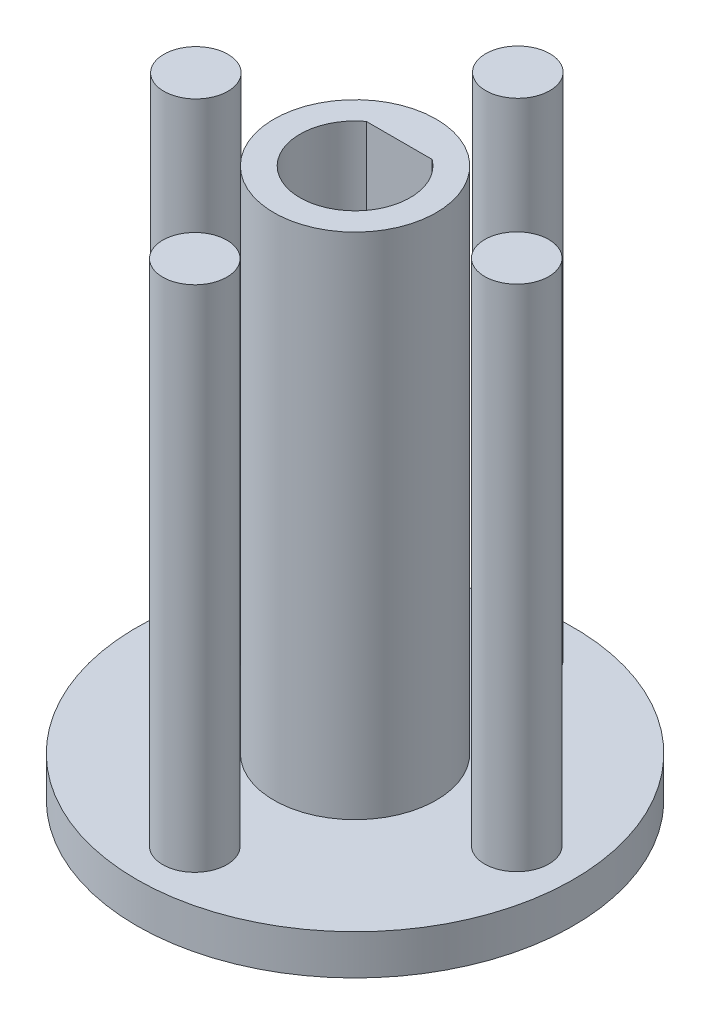
ISO-10303-21;
HEADER;
FILE_DESCRIPTION(('STEP AP214'),'2;1');
FILE_NAME('part.step','',(''),(''),'','','');
FILE_SCHEMA(('AUTOMOTIVE_DESIGN { 1 0 10303 214 1 1 1 1 }'));
ENDSEC;
DATA;
#1=APPLICATION_CONTEXT('core data for automotive mechanical design processes');
#2=APPLICATION_PROTOCOL_DEFINITION('international standard','automotive_design',2000,#1);
#3=PRODUCT_CONTEXT('',#1,'mechanical');
#4=PRODUCT('Part','Part','',(#3));
#5=PRODUCT_RELATED_PRODUCT_CATEGORY('part','',(#4));
#6=PRODUCT_DEFINITION_FORMATION('','',#4);
#7=PRODUCT_DEFINITION_CONTEXT('part definition',#1,'design');
#8=PRODUCT_DEFINITION('design','',#6,#7);
#9=PRODUCT_DEFINITION_SHAPE('','',#8);
#10=(LENGTH_UNIT() NAMED_UNIT(*) SI_UNIT(.MILLI.,.METRE.));
#11=(NAMED_UNIT(*) PLANE_ANGLE_UNIT() SI_UNIT($,.RADIAN.));
#12=(NAMED_UNIT(*) SI_UNIT($,.STERADIAN.) SOLID_ANGLE_UNIT());
#13=UNCERTAINTY_MEASURE_WITH_UNIT(LENGTH_MEASURE(1.E-05),#10,'distance_accuracy_value','');
#14=(GEOMETRIC_REPRESENTATION_CONTEXT(3) GLOBAL_UNCERTAINTY_ASSIGNED_CONTEXT((#13)) GLOBAL_UNIT_ASSIGNED_CONTEXT((#10,
#11,#12)) REPRESENTATION_CONTEXT('',''));
#15=CARTESIAN_POINT('',(0.,0.,0.));
#16=DIRECTION('',(0.,0.,1.));
#17=DIRECTION('',(1.,0.,0.));
#18=AXIS2_PLACEMENT_3D('',#15,#16,#17);
#19=CARTESIAN_POINT('',(0.,2.,0.));
#20=DIRECTION('',(0.,1.,0.));
#21=DIRECTION('',(0.,0.,1.));
#22=AXIS2_PLACEMENT_3D('',#19,#20,#21);
#23=PLANE('',#22);
#24=CARTESIAN_POINT('',(0.,2.,0.));
#25=DIRECTION('',(0.,1.,0.));
#26=DIRECTION('',(0.,0.,1.));
#27=AXIS2_PLACEMENT_3D('',#24,#25,#26);
#28=CIRCLE('',#27,10.9);
#29=CARTESIAN_POINT('',(0.,2.,10.9));
#30=VERTEX_POINT('',#29);
#31=EDGE_CURVE('E110',#30,#30,#28,.T.);
#32=ORIENTED_EDGE('',*,*,#31,.T.);
#33=EDGE_LOOP('',(#32));
#34=FACE_BOUND('',#33,.T.);
#35=CARTESIAN_POINT('',(-7.99946540436632,2.,-0.0531912101153402));
#36=DIRECTION('',(0.,1.,0.));
#37=DIRECTION('',(0.,0.,1.));
#38=AXIS2_PLACEMENT_3D('',#35,#36,#37);
#39=CIRCLE('',#38,1.6);
#40=CARTESIAN_POINT('',(-7.99946540436632,1.99999999999999,-1.65319121011534));
#41=VERTEX_POINT('',#40);
#42=EDGE_CURVE('E46',#41,#41,#39,.T.);
#43=ORIENTED_EDGE('',*,*,#42,.F.);
#44=EDGE_LOOP('',(#43));
#45=FACE_BOUND('',#44,.T.);
#46=CARTESIAN_POINT('',(0.0091799489627781,2.,8.00905715153994));
#47=DIRECTION('',(0.,1.,0.));
#48=DIRECTION('',(0.,0.,1.));
#49=AXIS2_PLACEMENT_3D('',#46,#47,#48);
#50=CIRCLE('',#49,1.6);
#51=CARTESIAN_POINT('',(0.0091799489627781,1.99999999999999,6.40905715153994));
#52=VERTEX_POINT('',#51);
#53=EDGE_CURVE('E106',#52,#52,#50,.F.);
#54=ORIENTED_EDGE('',*,*,#53,.T.);
#55=EDGE_LOOP('',(#54));
#56=FACE_BOUND('',#55,.T.);
#57=CARTESIAN_POINT('',(8.01767982733765,2.,-0.0533357152510716));
#58=DIRECTION('',(0.,1.,0.));
#59=DIRECTION('',(0.,0.,1.));
#60=AXIS2_PLACEMENT_3D('',#57,#58,#59);
#61=CIRCLE('',#60,1.6);
#62=CARTESIAN_POINT('',(8.01767982733765,1.99999999999999,-1.65333571525107));
#63=VERTEX_POINT('',#62);
#64=EDGE_CURVE('E100',#63,#63,#61,.F.);
#65=ORIENTED_EDGE('',*,*,#64,.T.);
#66=EDGE_LOOP('',(#65));
#67=FACE_BOUND('',#66,.T.);
#68=CARTESIAN_POINT('',(0.00903447400855788,2.,-8.11558407690636));
#69=DIRECTION('',(0.,1.,0.));
#70=DIRECTION('',(0.,0.,1.));
#71=AXIS2_PLACEMENT_3D('',#68,#69,#70);
#72=CIRCLE('',#71,1.6);
#73=CARTESIAN_POINT('',(0.00903447400855788,1.99999999999999,-9.71558407690635));
#74=VERTEX_POINT('',#73);
#75=EDGE_CURVE('E94',#74,#74,#72,.F.);
#76=ORIENTED_EDGE('',*,*,#75,.T.);
#77=EDGE_LOOP('',(#76));
#78=FACE_BOUND('',#77,.T.);
#79=CARTESIAN_POINT('',(0.,2.,0.));
#80=DIRECTION('',(0.,1.,0.));
#81=DIRECTION('',(0.,0.,1.));
#82=AXIS2_PLACEMENT_3D('',#79,#80,#81);
#83=CIRCLE('',#82,4.05);
#84=CARTESIAN_POINT('',(0.,1.99999999999999,-4.05));
#85=VERTEX_POINT('',#84);
#86=EDGE_CURVE('E88',#85,#85,#83,.F.);
#87=ORIENTED_EDGE('',*,*,#86,.T.);
#88=EDGE_LOOP('',(#87));
#89=FACE_BOUND('',#88,.T.);
#90=ADVANCED_FACE('F42',(#34,#45,#56,#67,#78,#89),#23,.T.);
#91=CARTESIAN_POINT('',(-7.99946540436632,27.4,-0.0531912101153402));
#92=DIRECTION('',(0.,-1.,0.));
#93=DIRECTION('',(0.,0.,-1.));
#94=AXIS2_PLACEMENT_3D('',#91,#92,#93);
#95=CYLINDRICAL_SURFACE('',#94,1.6);
#96=CARTESIAN_POINT('',(-7.99946540436632,27.4,-0.0531912101153402));
#97=DIRECTION('',(0.,1.,0.));
#98=DIRECTION('',(0.,0.,1.));
#99=AXIS2_PLACEMENT_3D('',#96,#97,#98);
#100=CIRCLE('',#99,1.6);
#101=CARTESIAN_POINT('',(-7.99946540436632,27.4,-1.65319121011534));
#102=VERTEX_POINT('',#101);
#103=EDGE_CURVE('E12',#102,#102,#100,.T.);
#104=CARTESIAN_POINT('',(-7.99946540436632,1.99999999999999,-1.65319121011534));
#105=CARTESIAN_POINT('',(-7.99946540436632,2.26458333333333,-1.65319121011534));
#106=CARTESIAN_POINT('',(-7.99946540436632,2.52916666666666,-1.65319121011534));
#107=CARTESIAN_POINT('',(-7.99946540436632,3.05833333333333,-1.65319121011534));
#108=CARTESIAN_POINT('',(-7.99946540436632,3.32291666666666,-1.65319121011534));
#109=CARTESIAN_POINT('',(-7.99946540436632,3.85208333333333,-1.65319121011534));
#110=CARTESIAN_POINT('',(-7.99946540436632,4.11666666666666,-1.65319121011534));
#111=CARTESIAN_POINT('',(-7.99946540436632,4.64583333333333,-1.65319121011534));
#112=CARTESIAN_POINT('',(-7.99946540436632,4.91041666666666,-1.65319121011534));
#113=CARTESIAN_POINT('',(-7.99946540436632,5.43958333333333,-1.65319121011534));
#114=CARTESIAN_POINT('',(-7.99946540436632,5.70416666666666,-1.65319121011534));
#115=CARTESIAN_POINT('',(-7.99946540436632,6.23333333333333,-1.65319121011534));
#116=CARTESIAN_POINT('',(-7.99946540436632,6.49791666666666,-1.65319121011534));
#117=CARTESIAN_POINT('',(-7.99946540436632,7.02708333333333,-1.65319121011534));
#118=CARTESIAN_POINT('',(-7.99946540436632,7.29166666666666,-1.65319121011534));
#119=CARTESIAN_POINT('',(-7.99946540436632,7.82083333333333,-1.65319121011534));
#120=CARTESIAN_POINT('',(-7.99946540436632,8.08541666666666,-1.65319121011534));
#121=CARTESIAN_POINT('',(-7.99946540436632,8.61458333333333,-1.65319121011534));
#122=CARTESIAN_POINT('',(-7.99946540436632,8.87916666666666,-1.65319121011534));
#123=CARTESIAN_POINT('',(-7.99946540436632,9.40833333333333,-1.65319121011534));
#124=CARTESIAN_POINT('',(-7.99946540436632,9.67291666666666,-1.65319121011534));
#125=CARTESIAN_POINT('',(-7.99946540436632,10.2020833333333,-1.65319121011534));
#126=CARTESIAN_POINT('',(-7.99946540436632,10.4666666666667,-1.65319121011534));
#127=CARTESIAN_POINT('',(-7.99946540436632,10.9958333333333,-1.65319121011534));
#128=CARTESIAN_POINT('',(-7.99946540436632,11.2604166666667,-1.65319121011534));
#129=CARTESIAN_POINT('',(-7.99946540436632,11.7895833333333,-1.65319121011534));
#130=CARTESIAN_POINT('',(-7.99946540436632,12.0541666666667,-1.65319121011534));
#131=CARTESIAN_POINT('',(-7.99946540436632,12.5833333333333,-1.65319121011534));
#132=CARTESIAN_POINT('',(-7.99946540436632,12.8479166666667,-1.65319121011534));
#133=CARTESIAN_POINT('',(-7.99946540436632,13.3770833333333,-1.65319121011534));
#134=CARTESIAN_POINT('',(-7.99946540436632,13.6416666666667,-1.65319121011534));
#135=CARTESIAN_POINT('',(-7.99946540436632,14.1708333333333,-1.65319121011534));
#136=CARTESIAN_POINT('',(-7.99946540436632,14.4354166666667,-1.65319121011534));
#137=CARTESIAN_POINT('',(-7.99946540436632,14.9645833333333,-1.65319121011534));
#138=CARTESIAN_POINT('',(-7.99946540436632,15.2291666666667,-1.65319121011534));
#139=CARTESIAN_POINT('',(-7.99946540436632,15.7583333333333,-1.65319121011534));
#140=CARTESIAN_POINT('',(-7.99946540436632,16.0229166666667,-1.65319121011534));
#141=CARTESIAN_POINT('',(-7.99946540436632,16.5520833333333,-1.65319121011534));
#142=CARTESIAN_POINT('',(-7.99946540436632,16.8166666666667,-1.65319121011534));
#143=CARTESIAN_POINT('',(-7.99946540436632,17.3458333333333,-1.65319121011534));
#144=CARTESIAN_POINT('',(-7.99946540436632,17.6104166666667,-1.65319121011534));
#145=CARTESIAN_POINT('',(-7.99946540436632,18.1395833333333,-1.65319121011534));
#146=CARTESIAN_POINT('',(-7.99946540436632,18.4041666666667,-1.65319121011534));
#147=CARTESIAN_POINT('',(-7.99946540436632,18.9333333333333,-1.65319121011534));
#148=CARTESIAN_POINT('',(-7.99946540436632,19.1979166666667,-1.65319121011534));
#149=CARTESIAN_POINT('',(-7.99946540436632,19.7270833333333,-1.65319121011534));
#150=CARTESIAN_POINT('',(-7.99946540436632,19.9916666666667,-1.65319121011534));
#151=CARTESIAN_POINT('',(-7.99946540436632,20.5208333333333,-1.65319121011534));
#152=CARTESIAN_POINT('',(-7.99946540436632,20.7854166666667,-1.65319121011534));
#153=CARTESIAN_POINT('',(-7.99946540436632,21.3145833333333,-1.65319121011534));
#154=CARTESIAN_POINT('',(-7.99946540436632,21.5791666666667,-1.65319121011534));
#155=CARTESIAN_POINT('',(-7.99946540436632,22.1083333333333,-1.65319121011534));
#156=CARTESIAN_POINT('',(-7.99946540436632,22.3729166666667,-1.65319121011534));
#157=CARTESIAN_POINT('',(-7.99946540436632,22.9020833333333,-1.65319121011534));
#158=CARTESIAN_POINT('',(-7.99946540436632,23.1666666666667,-1.65319121011534));
#159=CARTESIAN_POINT('',(-7.99946540436632,23.6958333333333,-1.65319121011534));
#160=CARTESIAN_POINT('',(-7.99946540436632,23.9604166666667,-1.65319121011534));
#161=CARTESIAN_POINT('',(-7.99946540436632,24.4895833333333,-1.65319121011534));
#162=CARTESIAN_POINT('',(-7.99946540436632,24.7541666666667,-1.65319121011534));
#163=CARTESIAN_POINT('',(-7.99946540436632,25.2833333333333,-1.65319121011534));
#164=CARTESIAN_POINT('',(-7.99946540436632,25.5479166666667,-1.65319121011534));
#165=CARTESIAN_POINT('',(-7.99946540436632,26.0770833333333,-1.65319121011534));
#166=CARTESIAN_POINT('',(-7.99946540436632,26.3416666666667,-1.65319121011534));
#167=CARTESIAN_POINT('',(-7.99946540436632,26.8708333333333,-1.65319121011534));
#168=CARTESIAN_POINT('',(-7.99946540436632,27.1354166666667,-1.65319121011534));
#169=CARTESIAN_POINT('',(-7.99946540436632,27.4,-1.65319121011534));
#170=B_SPLINE_CURVE_WITH_KNOTS('',3,(#104,#105,#106,#107,#108,#109,#110,#111,#112,#113,#114,
#115,#116,#117,#118,#119,#120,#121,#122,#123,#124,#125,#126,#127,#128,#129,#130,#131,#132,#133,
#134,#135,#136,#137,#138,#139,#140,#141,#142,#143,#144,#145,#146,#147,#148,#149,#150,#151,#152,
#153,#154,#155,#156,#157,#158,#159,#160,#161,#162,#163,#164,#165,#166,#167,#168,#169),
.UNSPECIFIED.,.F.,.F.,(4,2,2,2,2,2,2,2,2,2,2,2,2,2,2,2,2,2,2,2,2,2,2,2,2,2,2,2,2,2,2,2,4),(0.,
0.793749999999999,1.5875,2.38125,3.175,3.96875,4.7625,5.55625,6.35,7.14375,7.9375,8.73125,9.525,
10.31875,11.1125,11.90625,12.7,13.49375,14.2875,15.08125,15.875,16.66875,17.4625,18.25625,19.05,
19.84375,20.6375,21.43125,22.225,23.01875,23.8125,24.60625,25.4),.UNSPECIFIED.);
#171=EDGE_CURVE('BSEAM44',#41,#102,#170,.T.);
#172=ORIENTED_EDGE('',*,*,#42,.T.);
#173=ORIENTED_EDGE('',*,*,#103,.F.);
#174=ORIENTED_EDGE('',*,*,#171,.T.);
#175=ORIENTED_EDGE('',*,*,#171,.F.);
#176=EDGE_LOOP('',(#172,#174,#173,#175));
#177=FACE_BOUND('',#176,.T.);
#178=ADVANCED_FACE('F44',(#177),#95,.T.);
#179=CARTESIAN_POINT('',(-7.99946540436632,27.4,-0.0531912101153402));
#180=DIRECTION('',(0.,1.,0.));
#181=DIRECTION('',(0.,0.,1.));
#182=AXIS2_PLACEMENT_3D('',#179,#180,#181);
#183=PLANE('',#182);
#184=ORIENTED_EDGE('',*,*,#103,.T.);
#185=EDGE_LOOP('',(#184));
#186=FACE_BOUND('',#185,.T.);
#187=ADVANCED_FACE('F128',(#186),#183,.T.);
#188=CARTESIAN_POINT('',(0.,2.,0.));
#189=DIRECTION('',(0.,-1.,0.));
#190=DIRECTION('',(0.,0.,-1.));
#191=AXIS2_PLACEMENT_3D('',#188,#189,#190);
#192=CYLINDRICAL_SURFACE('',#191,10.9);
#193=ORIENTED_EDGE('',*,*,#31,.F.);
#194=EDGE_LOOP('',(#193));
#195=FACE_BOUND('',#194,.T.);
#196=CARTESIAN_POINT('',(0.,0.,0.));
#197=DIRECTION('',(0.,1.,0.));
#198=DIRECTION('',(0.,0.,1.));
#199=AXIS2_PLACEMENT_3D('',#196,#197,#198);
#200=CIRCLE('',#199,10.9);
#201=CARTESIAN_POINT('',(0.,0.,10.9));
#202=VERTEX_POINT('',#201);
#203=EDGE_CURVE('E109',#202,#202,#200,.T.);
#204=ORIENTED_EDGE('',*,*,#203,.T.);
#205=EDGE_LOOP('',(#204));
#206=FACE_BOUND('',#205,.T.);
#207=ADVANCED_FACE('F116',(#195,#206),#192,.T.);
#208=CARTESIAN_POINT('',(-7.99946540436632,0.,-0.0531912101153402));
#209=DIRECTION('',(0.,1.,0.));
#210=DIRECTION('',(0.,0.,1.));
#211=AXIS2_PLACEMENT_3D('',#208,#209,#210);
#212=PLANE('',#211);
#213=ORIENTED_EDGE('',*,*,#203,.F.);
#214=EDGE_LOOP('',(#213));
#215=FACE_BOUND('',#214,.T.);
#216=ADVANCED_FACE('F118',(#215),#212,.F.);
#217=CARTESIAN_POINT('',(0.0091799489627781,27.4,8.00905715153994));
#218=DIRECTION('',(0.,-1.,0.));
#219=DIRECTION('',(0.,0.,-1.));
#220=AXIS2_PLACEMENT_3D('',#217,#218,#219);
#221=CYLINDRICAL_SURFACE('',#220,1.6);
#222=CARTESIAN_POINT('',(0.0091799489627781,27.4,8.00905715153994));
#223=DIRECTION('',(0.,1.,0.));
#224=DIRECTION('',(0.,0.,1.));
#225=AXIS2_PLACEMENT_3D('',#222,#223,#224);
#226=CIRCLE('',#225,1.6);
#227=CARTESIAN_POINT('',(0.0091799489627781,27.4,6.40905715153994));
#228=VERTEX_POINT('',#227);
#229=EDGE_CURVE('E103',#228,#228,#226,.T.);
#230=CARTESIAN_POINT('',(0.0091799489627781,1.99999999999999,6.40905715153994));
#231=CARTESIAN_POINT('',(0.0091799489627781,2.26458333333333,6.40905715153994));
#232=CARTESIAN_POINT('',(0.0091799489627781,2.52916666666666,6.40905715153994));
#233=CARTESIAN_POINT('',(0.0091799489627781,3.05833333333333,6.40905715153994));
#234=CARTESIAN_POINT('',(0.0091799489627781,3.32291666666666,6.40905715153994));
#235=CARTESIAN_POINT('',(0.0091799489627781,3.85208333333333,6.40905715153994));
#236=CARTESIAN_POINT('',(0.0091799489627781,4.11666666666666,6.40905715153994));
#237=CARTESIAN_POINT('',(0.0091799489627781,4.64583333333333,6.40905715153994));
#238=CARTESIAN_POINT('',(0.0091799489627781,4.91041666666666,6.40905715153994));
#239=CARTESIAN_POINT('',(0.0091799489627781,5.43958333333333,6.40905715153994));
#240=CARTESIAN_POINT('',(0.0091799489627781,5.70416666666666,6.40905715153994));
#241=CARTESIAN_POINT('',(0.0091799489627781,6.23333333333333,6.40905715153994));
#242=CARTESIAN_POINT('',(0.0091799489627781,6.49791666666666,6.40905715153994));
#243=CARTESIAN_POINT('',(0.0091799489627781,7.02708333333333,6.40905715153994));
#244=CARTESIAN_POINT('',(0.0091799489627781,7.29166666666666,6.40905715153994));
#245=CARTESIAN_POINT('',(0.0091799489627781,7.82083333333333,6.40905715153994));
#246=CARTESIAN_POINT('',(0.0091799489627781,8.08541666666666,6.40905715153994));
#247=CARTESIAN_POINT('',(0.0091799489627781,8.61458333333333,6.40905715153994));
#248=CARTESIAN_POINT('',(0.0091799489627781,8.87916666666666,6.40905715153994));
#249=CARTESIAN_POINT('',(0.0091799489627781,9.40833333333333,6.40905715153994));
#250=CARTESIAN_POINT('',(0.0091799489627781,9.67291666666666,6.40905715153994));
#251=CARTESIAN_POINT('',(0.0091799489627781,10.2020833333333,6.40905715153994));
#252=CARTESIAN_POINT('',(0.0091799489627781,10.4666666666667,6.40905715153994));
#253=CARTESIAN_POINT('',(0.0091799489627781,10.9958333333333,6.40905715153994));
#254=CARTESIAN_POINT('',(0.0091799489627781,11.2604166666667,6.40905715153994));
#255=CARTESIAN_POINT('',(0.0091799489627781,11.7895833333333,6.40905715153994));
#256=CARTESIAN_POINT('',(0.0091799489627781,12.0541666666667,6.40905715153994));
#257=CARTESIAN_POINT('',(0.0091799489627781,12.5833333333333,6.40905715153994));
#258=CARTESIAN_POINT('',(0.0091799489627781,12.8479166666667,6.40905715153994));
#259=CARTESIAN_POINT('',(0.0091799489627781,13.3770833333333,6.40905715153994));
#260=CARTESIAN_POINT('',(0.0091799489627781,13.6416666666667,6.40905715153994));
#261=CARTESIAN_POINT('',(0.0091799489627781,14.1708333333333,6.40905715153994));
#262=CARTESIAN_POINT('',(0.0091799489627781,14.4354166666667,6.40905715153994));
#263=CARTESIAN_POINT('',(0.0091799489627781,14.9645833333333,6.40905715153994));
#264=CARTESIAN_POINT('',(0.0091799489627781,15.2291666666667,6.40905715153994));
#265=CARTESIAN_POINT('',(0.0091799489627781,15.7583333333333,6.40905715153994));
#266=CARTESIAN_POINT('',(0.0091799489627781,16.0229166666667,6.40905715153994));
#267=CARTESIAN_POINT('',(0.0091799489627781,16.5520833333333,6.40905715153994));
#268=CARTESIAN_POINT('',(0.0091799489627781,16.8166666666667,6.40905715153994));
#269=CARTESIAN_POINT('',(0.0091799489627781,17.3458333333333,6.40905715153994));
#270=CARTESIAN_POINT('',(0.0091799489627781,17.6104166666667,6.40905715153994));
#271=CARTESIAN_POINT('',(0.0091799489627781,18.1395833333333,6.40905715153994));
#272=CARTESIAN_POINT('',(0.0091799489627781,18.4041666666667,6.40905715153994));
#273=CARTESIAN_POINT('',(0.0091799489627781,18.9333333333333,6.40905715153994));
#274=CARTESIAN_POINT('',(0.0091799489627781,19.1979166666667,6.40905715153994));
#275=CARTESIAN_POINT('',(0.0091799489627781,19.7270833333333,6.40905715153994));
#276=CARTESIAN_POINT('',(0.0091799489627781,19.9916666666667,6.40905715153994));
#277=CARTESIAN_POINT('',(0.0091799489627781,20.5208333333333,6.40905715153994));
#278=CARTESIAN_POINT('',(0.0091799489627781,20.7854166666667,6.40905715153994));
#279=CARTESIAN_POINT('',(0.0091799489627781,21.3145833333333,6.40905715153994));
#280=CARTESIAN_POINT('',(0.0091799489627781,21.5791666666667,6.40905715153994));
#281=CARTESIAN_POINT('',(0.0091799489627781,22.1083333333333,6.40905715153994));
#282=CARTESIAN_POINT('',(0.0091799489627781,22.3729166666667,6.40905715153994));
#283=CARTESIAN_POINT('',(0.0091799489627781,22.9020833333333,6.40905715153994));
#284=CARTESIAN_POINT('',(0.0091799489627781,23.1666666666667,6.40905715153994));
#285=CARTESIAN_POINT('',(0.0091799489627781,23.6958333333333,6.40905715153994));
#286=CARTESIAN_POINT('',(0.0091799489627781,23.9604166666667,6.40905715153994));
#287=CARTESIAN_POINT('',(0.0091799489627781,24.4895833333333,6.40905715153994));
#288=CARTESIAN_POINT('',(0.0091799489627781,24.7541666666667,6.40905715153994));
#289=CARTESIAN_POINT('',(0.0091799489627781,25.2833333333333,6.40905715153994));
#290=CARTESIAN_POINT('',(0.0091799489627781,25.5479166666667,6.40905715153994));
#291=CARTESIAN_POINT('',(0.0091799489627781,26.0770833333333,6.40905715153994));
#292=CARTESIAN_POINT('',(0.0091799489627781,26.3416666666667,6.40905715153994));
#293=CARTESIAN_POINT('',(0.0091799489627781,26.8708333333333,6.40905715153994));
#294=CARTESIAN_POINT('',(0.0091799489627781,27.1354166666667,6.40905715153994));
#295=CARTESIAN_POINT('',(0.0091799489627781,27.4,6.40905715153994));
#296=B_SPLINE_CURVE_WITH_KNOTS('',3,(#230,#231,#232,#233,#234,#235,#236,#237,#238,#239,#240,
#241,#242,#243,#244,#245,#246,#247,#248,#249,#250,#251,#252,#253,#254,#255,#256,#257,#258,#259,
#260,#261,#262,#263,#264,#265,#266,#267,#268,#269,#270,#271,#272,#273,#274,#275,#276,#277,#278,
#279,#280,#281,#282,#283,#284,#285,#286,#287,#288,#289,#290,#291,#292,#293,#294,#295),
.UNSPECIFIED.,.F.,.F.,(4,2,2,2,2,2,2,2,2,2,2,2,2,2,2,2,2,2,2,2,2,2,2,2,2,2,2,2,2,2,2,2,4),(0.,
0.793749999999999,1.5875,2.38125,3.175,3.96875,4.7625,5.55625,6.35,7.14375,7.9375,8.73125,9.525,
10.31875,11.1125,11.90625,12.7,13.49375,14.2875,15.08125,15.875,16.66875,17.4625,18.25625,19.05,
19.84375,20.6375,21.43125,22.225,23.01875,23.8125,24.60625,25.4),.UNSPECIFIED.);
#297=EDGE_CURVE('BSEAM120',#52,#228,#296,.T.);
#298=ORIENTED_EDGE('',*,*,#53,.F.);
#299=ORIENTED_EDGE('',*,*,#229,.F.);
#300=ORIENTED_EDGE('',*,*,#297,.T.);
#301=ORIENTED_EDGE('',*,*,#297,.F.);
#302=EDGE_LOOP('',(#298,#300,#299,#301));
#303=FACE_BOUND('',#302,.T.);
#304=ADVANCED_FACE('F120',(#303),#221,.T.);
#305=CARTESIAN_POINT('',(0.0091799489627781,27.4,8.00905715153994));
#306=DIRECTION('',(0.,1.,0.));
#307=DIRECTION('',(0.,0.,1.));
#308=AXIS2_PLACEMENT_3D('',#305,#306,#307);
#309=PLANE('',#308);
#310=ORIENTED_EDGE('',*,*,#229,.T.);
#311=EDGE_LOOP('',(#310));
#312=FACE_BOUND('',#311,.T.);
#313=ADVANCED_FACE('F125',(#312),#309,.T.);
#314=CARTESIAN_POINT('',(8.01767982733765,27.4,-0.0533357152510716));
#315=DIRECTION('',(0.,-1.,0.));
#316=DIRECTION('',(0.,0.,-1.));
#317=AXIS2_PLACEMENT_3D('',#314,#315,#316);
#318=CYLINDRICAL_SURFACE('',#317,1.6);
#319=CARTESIAN_POINT('',(8.01767982733765,27.4,-0.0533357152510716));
#320=DIRECTION('',(0.,1.,0.));
#321=DIRECTION('',(0.,0.,1.));
#322=AXIS2_PLACEMENT_3D('',#319,#320,#321);
#323=CIRCLE('',#322,1.6);
#324=CARTESIAN_POINT('',(8.01767982733765,27.4,-1.65333571525107));
#325=VERTEX_POINT('',#324);
#326=EDGE_CURVE('E97',#325,#325,#323,.T.);
#327=CARTESIAN_POINT('',(8.01767982733765,1.99999999999999,-1.65333571525107));
#328=CARTESIAN_POINT('',(8.01767982733765,2.26458333333333,-1.65333571525107));
#329=CARTESIAN_POINT('',(8.01767982733765,2.52916666666666,-1.65333571525107));
#330=CARTESIAN_POINT('',(8.01767982733765,3.05833333333333,-1.65333571525107));
#331=CARTESIAN_POINT('',(8.01767982733765,3.32291666666666,-1.65333571525107));
#332=CARTESIAN_POINT('',(8.01767982733765,3.85208333333333,-1.65333571525107));
#333=CARTESIAN_POINT('',(8.01767982733765,4.11666666666666,-1.65333571525107));
#334=CARTESIAN_POINT('',(8.01767982733765,4.64583333333333,-1.65333571525107));
#335=CARTESIAN_POINT('',(8.01767982733765,4.91041666666666,-1.65333571525107));
#336=CARTESIAN_POINT('',(8.01767982733765,5.43958333333333,-1.65333571525107));
#337=CARTESIAN_POINT('',(8.01767982733765,5.70416666666666,-1.65333571525107));
#338=CARTESIAN_POINT('',(8.01767982733765,6.23333333333333,-1.65333571525107));
#339=CARTESIAN_POINT('',(8.01767982733765,6.49791666666666,-1.65333571525107));
#340=CARTESIAN_POINT('',(8.01767982733765,7.02708333333333,-1.65333571525107));
#341=CARTESIAN_POINT('',(8.01767982733765,7.29166666666666,-1.65333571525107));
#342=CARTESIAN_POINT('',(8.01767982733765,7.82083333333333,-1.65333571525107));
#343=CARTESIAN_POINT('',(8.01767982733765,8.08541666666666,-1.65333571525107));
#344=CARTESIAN_POINT('',(8.01767982733765,8.61458333333333,-1.65333571525107));
#345=CARTESIAN_POINT('',(8.01767982733765,8.87916666666666,-1.65333571525107));
#346=CARTESIAN_POINT('',(8.01767982733765,9.40833333333333,-1.65333571525107));
#347=CARTESIAN_POINT('',(8.01767982733765,9.67291666666666,-1.65333571525107));
#348=CARTESIAN_POINT('',(8.01767982733765,10.2020833333333,-1.65333571525107));
#349=CARTESIAN_POINT('',(8.01767982733765,10.4666666666667,-1.65333571525107));
#350=CARTESIAN_POINT('',(8.01767982733765,10.9958333333333,-1.65333571525107));
#351=CARTESIAN_POINT('',(8.01767982733765,11.2604166666667,-1.65333571525107));
#352=CARTESIAN_POINT('',(8.01767982733765,11.7895833333333,-1.65333571525107));
#353=CARTESIAN_POINT('',(8.01767982733765,12.0541666666667,-1.65333571525107));
#354=CARTESIAN_POINT('',(8.01767982733765,12.5833333333333,-1.65333571525107));
#355=CARTESIAN_POINT('',(8.01767982733765,12.8479166666667,-1.65333571525107));
#356=CARTESIAN_POINT('',(8.01767982733765,13.3770833333333,-1.65333571525107));
#357=CARTESIAN_POINT('',(8.01767982733765,13.6416666666667,-1.65333571525107));
#358=CARTESIAN_POINT('',(8.01767982733765,14.1708333333333,-1.65333571525107));
#359=CARTESIAN_POINT('',(8.01767982733765,14.4354166666667,-1.65333571525107));
#360=CARTESIAN_POINT('',(8.01767982733765,14.9645833333333,-1.65333571525107));
#361=CARTESIAN_POINT('',(8.01767982733765,15.2291666666667,-1.65333571525107));
#362=CARTESIAN_POINT('',(8.01767982733765,15.7583333333333,-1.65333571525107));
#363=CARTESIAN_POINT('',(8.01767982733765,16.0229166666667,-1.65333571525107));
#364=CARTESIAN_POINT('',(8.01767982733765,16.5520833333333,-1.65333571525107));
#365=CARTESIAN_POINT('',(8.01767982733765,16.8166666666667,-1.65333571525107));
#366=CARTESIAN_POINT('',(8.01767982733765,17.3458333333333,-1.65333571525107));
#367=CARTESIAN_POINT('',(8.01767982733765,17.6104166666667,-1.65333571525107));
#368=CARTESIAN_POINT('',(8.01767982733765,18.1395833333333,-1.65333571525107));
#369=CARTESIAN_POINT('',(8.01767982733765,18.4041666666667,-1.65333571525107));
#370=CARTESIAN_POINT('',(8.01767982733765,18.9333333333333,-1.65333571525107));
#371=CARTESIAN_POINT('',(8.01767982733765,19.1979166666667,-1.65333571525107));
#372=CARTESIAN_POINT('',(8.01767982733765,19.7270833333333,-1.65333571525107));
#373=CARTESIAN_POINT('',(8.01767982733765,19.9916666666667,-1.65333571525107));
#374=CARTESIAN_POINT('',(8.01767982733765,20.5208333333333,-1.65333571525107));
#375=CARTESIAN_POINT('',(8.01767982733765,20.7854166666667,-1.65333571525107));
#376=CARTESIAN_POINT('',(8.01767982733765,21.3145833333333,-1.65333571525107));
#377=CARTESIAN_POINT('',(8.01767982733765,21.5791666666667,-1.65333571525107));
#378=CARTESIAN_POINT('',(8.01767982733765,22.1083333333333,-1.65333571525107));
#379=CARTESIAN_POINT('',(8.01767982733765,22.3729166666667,-1.65333571525107));
#380=CARTESIAN_POINT('',(8.01767982733765,22.9020833333333,-1.65333571525107));
#381=CARTESIAN_POINT('',(8.01767982733765,23.1666666666667,-1.65333571525107));
#382=CARTESIAN_POINT('',(8.01767982733765,23.6958333333333,-1.65333571525107));
#383=CARTESIAN_POINT('',(8.01767982733765,23.9604166666667,-1.65333571525107));
#384=CARTESIAN_POINT('',(8.01767982733765,24.4895833333333,-1.65333571525107));
#385=CARTESIAN_POINT('',(8.01767982733765,24.7541666666667,-1.65333571525107));
#386=CARTESIAN_POINT('',(8.01767982733765,25.2833333333333,-1.65333571525107));
#387=CARTESIAN_POINT('',(8.01767982733765,25.5479166666667,-1.65333571525107));
#388=CARTESIAN_POINT('',(8.01767982733765,26.0770833333333,-1.65333571525107));
#389=CARTESIAN_POINT('',(8.01767982733765,26.3416666666667,-1.65333571525107));
#390=CARTESIAN_POINT('',(8.01767982733765,26.8708333333333,-1.65333571525107));
#391=CARTESIAN_POINT('',(8.01767982733765,27.1354166666667,-1.65333571525107));
#392=CARTESIAN_POINT('',(8.01767982733765,27.4,-1.65333571525107));
#393=B_SPLINE_CURVE_WITH_KNOTS('',3,(#327,#328,#329,#330,#331,#332,#333,#334,#335,#336,#337,
#338,#339,#340,#341,#342,#343,#344,#345,#346,#347,#348,#349,#350,#351,#352,#353,#354,#355,#356,
#357,#358,#359,#360,#361,#362,#363,#364,#365,#366,#367,#368,#369,#370,#371,#372,#373,#374,#375,
#376,#377,#378,#379,#380,#381,#382,#383,#384,#385,#386,#387,#388,#389,#390,#391,#392),
.UNSPECIFIED.,.F.,.F.,(4,2,2,2,2,2,2,2,2,2,2,2,2,2,2,2,2,2,2,2,2,2,2,2,2,2,2,2,2,2,2,2,4),(0.,
0.793749999999999,1.5875,2.38125,3.175,3.96875,4.7625,5.55625,6.35,7.14375,7.9375,8.73125,9.525,
10.31875,11.1125,11.90625,12.7,13.49375,14.2875,15.08125,15.875,16.66875,17.4625,18.25625,19.05,
19.84375,20.6375,21.43125,22.225,23.01875,23.8125,24.60625,25.4),.UNSPECIFIED.);
#394=EDGE_CURVE('BSEAM164',#63,#325,#393,.T.);
#395=ORIENTED_EDGE('',*,*,#64,.F.);
#396=ORIENTED_EDGE('',*,*,#326,.F.);
#397=ORIENTED_EDGE('',*,*,#394,.T.);
#398=ORIENTED_EDGE('',*,*,#394,.F.);
#399=EDGE_LOOP('',(#395,#397,#396,#398));
#400=FACE_BOUND('',#399,.T.);
#401=ADVANCED_FACE('F164',(#400),#318,.T.);
#402=CARTESIAN_POINT('',(8.01767982733765,27.4,-0.0533357152510716));
#403=DIRECTION('',(0.,1.,0.));
#404=DIRECTION('',(0.,0.,1.));
#405=AXIS2_PLACEMENT_3D('',#402,#403,#404);
#406=PLANE('',#405);
#407=ORIENTED_EDGE('',*,*,#326,.T.);
#408=EDGE_LOOP('',(#407));
#409=FACE_BOUND('',#408,.T.);
#410=ADVANCED_FACE('F159',(#409),#406,.T.);
#411=CARTESIAN_POINT('',(0.00903447400855788,27.4,-8.11558407690636));
#412=DIRECTION('',(0.,-1.,0.));
#413=DIRECTION('',(0.,0.,-1.));
#414=AXIS2_PLACEMENT_3D('',#411,#412,#413);
#415=CYLINDRICAL_SURFACE('',#414,1.6);
#416=CARTESIAN_POINT('',(0.00903447400855788,27.4,-8.11558407690636));
#417=DIRECTION('',(0.,1.,0.));
#418=DIRECTION('',(0.,0.,1.));
#419=AXIS2_PLACEMENT_3D('',#416,#417,#418);
#420=CIRCLE('',#419,1.6);
#421=CARTESIAN_POINT('',(0.00903447400855788,27.4,-9.71558407690635));
#422=VERTEX_POINT('',#421);
#423=EDGE_CURVE('E91',#422,#422,#420,.T.);
#424=CARTESIAN_POINT('',(0.00903447400855788,1.99999999999999,-9.71558407690635));
#425=CARTESIAN_POINT('',(0.00903447400855788,2.26458333333333,-9.71558407690635));
#426=CARTESIAN_POINT('',(0.00903447400855788,2.52916666666666,-9.71558407690635));
#427=CARTESIAN_POINT('',(0.00903447400855788,3.05833333333333,-9.71558407690635));
#428=CARTESIAN_POINT('',(0.00903447400855788,3.32291666666666,-9.71558407690635));
#429=CARTESIAN_POINT('',(0.00903447400855788,3.85208333333333,-9.71558407690635));
#430=CARTESIAN_POINT('',(0.00903447400855788,4.11666666666666,-9.71558407690635));
#431=CARTESIAN_POINT('',(0.00903447400855788,4.64583333333333,-9.71558407690635));
#432=CARTESIAN_POINT('',(0.00903447400855788,4.91041666666666,-9.71558407690635));
#433=CARTESIAN_POINT('',(0.00903447400855788,5.43958333333333,-9.71558407690635));
#434=CARTESIAN_POINT('',(0.00903447400855788,5.70416666666666,-9.71558407690635));
#435=CARTESIAN_POINT('',(0.00903447400855788,6.23333333333333,-9.71558407690635));
#436=CARTESIAN_POINT('',(0.00903447400855788,6.49791666666666,-9.71558407690635));
#437=CARTESIAN_POINT('',(0.00903447400855788,7.02708333333333,-9.71558407690635));
#438=CARTESIAN_POINT('',(0.00903447400855788,7.29166666666666,-9.71558407690635));
#439=CARTESIAN_POINT('',(0.00903447400855788,7.82083333333333,-9.71558407690635));
#440=CARTESIAN_POINT('',(0.00903447400855788,8.08541666666666,-9.71558407690635));
#441=CARTESIAN_POINT('',(0.00903447400855788,8.61458333333333,-9.71558407690635));
#442=CARTESIAN_POINT('',(0.00903447400855788,8.87916666666666,-9.71558407690635));
#443=CARTESIAN_POINT('',(0.00903447400855788,9.40833333333333,-9.71558407690635));
#444=CARTESIAN_POINT('',(0.00903447400855788,9.67291666666666,-9.71558407690635));
#445=CARTESIAN_POINT('',(0.00903447400855788,10.2020833333333,-9.71558407690635));
#446=CARTESIAN_POINT('',(0.00903447400855788,10.4666666666667,-9.71558407690635));
#447=CARTESIAN_POINT('',(0.00903447400855788,10.9958333333333,-9.71558407690635));
#448=CARTESIAN_POINT('',(0.00903447400855788,11.2604166666667,-9.71558407690635));
#449=CARTESIAN_POINT('',(0.00903447400855788,11.7895833333333,-9.71558407690635));
#450=CARTESIAN_POINT('',(0.00903447400855788,12.0541666666667,-9.71558407690635));
#451=CARTESIAN_POINT('',(0.00903447400855788,12.5833333333333,-9.71558407690635));
#452=CARTESIAN_POINT('',(0.00903447400855788,12.8479166666667,-9.71558407690635));
#453=CARTESIAN_POINT('',(0.00903447400855788,13.3770833333333,-9.71558407690635));
#454=CARTESIAN_POINT('',(0.00903447400855788,13.6416666666667,-9.71558407690635));
#455=CARTESIAN_POINT('',(0.00903447400855788,14.1708333333333,-9.71558407690635));
#456=CARTESIAN_POINT('',(0.00903447400855788,14.4354166666667,-9.71558407690635));
#457=CARTESIAN_POINT('',(0.00903447400855788,14.9645833333333,-9.71558407690635));
#458=CARTESIAN_POINT('',(0.00903447400855788,15.2291666666667,-9.71558407690635));
#459=CARTESIAN_POINT('',(0.00903447400855788,15.7583333333333,-9.71558407690635));
#460=CARTESIAN_POINT('',(0.00903447400855788,16.0229166666667,-9.71558407690635));
#461=CARTESIAN_POINT('',(0.00903447400855788,16.5520833333333,-9.71558407690635));
#462=CARTESIAN_POINT('',(0.00903447400855788,16.8166666666667,-9.71558407690635));
#463=CARTESIAN_POINT('',(0.00903447400855788,17.3458333333333,-9.71558407690635));
#464=CARTESIAN_POINT('',(0.00903447400855788,17.6104166666667,-9.71558407690635));
#465=CARTESIAN_POINT('',(0.00903447400855788,18.1395833333333,-9.71558407690635));
#466=CARTESIAN_POINT('',(0.00903447400855788,18.4041666666667,-9.71558407690635));
#467=CARTESIAN_POINT('',(0.00903447400855788,18.9333333333333,-9.71558407690635));
#468=CARTESIAN_POINT('',(0.00903447400855788,19.1979166666667,-9.71558407690635));
#469=CARTESIAN_POINT('',(0.00903447400855788,19.7270833333333,-9.71558407690635));
#470=CARTESIAN_POINT('',(0.00903447400855788,19.9916666666667,-9.71558407690635));
#471=CARTESIAN_POINT('',(0.00903447400855788,20.5208333333333,-9.71558407690635));
#472=CARTESIAN_POINT('',(0.00903447400855788,20.7854166666667,-9.71558407690635));
#473=CARTESIAN_POINT('',(0.00903447400855788,21.3145833333333,-9.71558407690635));
#474=CARTESIAN_POINT('',(0.00903447400855788,21.5791666666667,-9.71558407690635));
#475=CARTESIAN_POINT('',(0.00903447400855788,22.1083333333333,-9.71558407690635));
#476=CARTESIAN_POINT('',(0.00903447400855788,22.3729166666667,-9.71558407690635));
#477=CARTESIAN_POINT('',(0.00903447400855788,22.9020833333333,-9.71558407690635));
#478=CARTESIAN_POINT('',(0.00903447400855788,23.1666666666667,-9.71558407690635));
#479=CARTESIAN_POINT('',(0.00903447400855788,23.6958333333333,-9.71558407690635));
#480=CARTESIAN_POINT('',(0.00903447400855788,23.9604166666667,-9.71558407690635));
#481=CARTESIAN_POINT('',(0.00903447400855788,24.4895833333333,-9.71558407690635));
#482=CARTESIAN_POINT('',(0.00903447400855788,24.7541666666667,-9.71558407690635));
#483=CARTESIAN_POINT('',(0.00903447400855788,25.2833333333333,-9.71558407690635));
#484=CARTESIAN_POINT('',(0.00903447400855788,25.5479166666667,-9.71558407690635));
#485=CARTESIAN_POINT('',(0.00903447400855788,26.0770833333333,-9.71558407690635));
#486=CARTESIAN_POINT('',(0.00903447400855788,26.3416666666667,-9.71558407690635));
#487=CARTESIAN_POINT('',(0.00903447400855788,26.8708333333333,-9.71558407690635));
#488=CARTESIAN_POINT('',(0.00903447400855788,27.1354166666667,-9.71558407690635));
#489=CARTESIAN_POINT('',(0.00903447400855788,27.4,-9.71558407690635));
#490=B_SPLINE_CURVE_WITH_KNOTS('',3,(#424,#425,#426,#427,#428,#429,#430,#431,#432,#433,#434,
#435,#436,#437,#438,#439,#440,#441,#442,#443,#444,#445,#446,#447,#448,#449,#450,#451,#452,#453,
#454,#455,#456,#457,#458,#459,#460,#461,#462,#463,#464,#465,#466,#467,#468,#469,#470,#471,#472,
#473,#474,#475,#476,#477,#478,#479,#480,#481,#482,#483,#484,#485,#486,#487,#488,#489),
.UNSPECIFIED.,.F.,.F.,(4,2,2,2,2,2,2,2,2,2,2,2,2,2,2,2,2,2,2,2,2,2,2,2,2,2,2,2,2,2,2,2,4),(0.,
0.793749999999999,1.5875,2.38125,3.175,3.96875,4.7625,5.55625,6.35,7.14375,7.9375,8.73125,9.525,
10.31875,11.1125,11.90625,12.7,13.49375,14.2875,15.08125,15.875,16.66875,17.4625,18.25625,19.05,
19.84375,20.6375,21.43125,22.225,23.01875,23.8125,24.60625,25.4),.UNSPECIFIED.);
#491=EDGE_CURVE('BSEAM155',#74,#422,#490,.T.);
#492=ORIENTED_EDGE('',*,*,#75,.F.);
#493=ORIENTED_EDGE('',*,*,#423,.F.);
#494=ORIENTED_EDGE('',*,*,#491,.T.);
#495=ORIENTED_EDGE('',*,*,#491,.F.);
#496=EDGE_LOOP('',(#492,#494,#493,#495));
#497=FACE_BOUND('',#496,.T.);
#498=ADVANCED_FACE('F155',(#497),#415,.T.);
#499=CARTESIAN_POINT('',(0.00903447400855788,27.4,-8.11558407690636));
#500=DIRECTION('',(0.,1.,0.));
#501=DIRECTION('',(0.,0.,1.));
#502=AXIS2_PLACEMENT_3D('',#499,#500,#501);
#503=PLANE('',#502);
#504=ORIENTED_EDGE('',*,*,#423,.T.);
#505=EDGE_LOOP('',(#504));
#506=FACE_BOUND('',#505,.T.);
#507=ADVANCED_FACE('F158',(#506),#503,.T.);
#508=CARTESIAN_POINT('',(0.,27.4,0.));
#509=DIRECTION('',(0.,1.,0.));
#510=DIRECTION('',(0.,0.,1.));
#511=AXIS2_PLACEMENT_3D('',#508,#509,#510);
#512=PLANE('',#511);
#513=CARTESIAN_POINT('',(0.,27.4,0.));
#514=DIRECTION('',(0.,1.,0.));
#515=DIRECTION('',(0.,0.,1.));
#516=AXIS2_PLACEMENT_3D('',#513,#514,#515);
#517=CIRCLE('',#516,4.05);
#518=CARTESIAN_POINT('',(0.,27.4,-4.05));
#519=VERTEX_POINT('',#518);
#520=EDGE_CURVE('E75',#519,#519,#517,.T.);
#521=ORIENTED_EDGE('',*,*,#520,.T.);
#522=EDGE_LOOP('',(#521));
#523=FACE_BOUND('',#522,.T.);
#524=DIRECTION('',(1.,0.,0.));
#525=VECTOR('',#524,1.);
#526=CARTESIAN_POINT('',(-1.64377719476721,27.4,-2.20465338181839));
#527=LINE('',#526,#525);
#528=CARTESIAN_POINT('',(-1.64377719476721,27.4,-2.20465338181839));
#529=VERTEX_POINT('',#528);
#530=CARTESIAN_POINT('',(1.64377719476721,27.4,-2.20465338181839));
#531=VERTEX_POINT('',#530);
#532=EDGE_CURVE('E71',#529,#531,#527,.T.);
#533=ORIENTED_EDGE('',*,*,#532,.T.);
#534=CARTESIAN_POINT('',(0.,27.4,0.));
#535=DIRECTION('',(0.,1.,0.));
#536=DIRECTION('',(0.,0.,1.));
#537=AXIS2_PLACEMENT_3D('',#534,#535,#536);
#538=CIRCLE('',#537,2.75);
#539=EDGE_CURVE('E77',#529,#531,#538,.T.);
#540=ORIENTED_EDGE('',*,*,#539,.F.);
#541=EDGE_LOOP('',(#533,#540));
#542=FACE_BOUND('',#541,.T.);
#543=ADVANCED_FACE('F81',(#523,#542),#512,.T.);
#544=CARTESIAN_POINT('',(0.,27.4,0.));
#545=DIRECTION('',(0.,-1.,0.));
#546=DIRECTION('',(0.,0.,-1.));
#547=AXIS2_PLACEMENT_3D('',#544,#545,#546);
#548=CYLINDRICAL_SURFACE('',#547,4.05);
#549=CARTESIAN_POINT('',(0.,1.99999999999999,-4.05));
#550=CARTESIAN_POINT('',(0.,2.26458333333333,-4.05));
#551=CARTESIAN_POINT('',(0.,2.52916666666666,-4.05));
#552=CARTESIAN_POINT('',(0.,3.05833333333333,-4.05));
#553=CARTESIAN_POINT('',(0.,3.32291666666666,-4.05));
#554=CARTESIAN_POINT('',(0.,3.85208333333333,-4.05));
#555=CARTESIAN_POINT('',(0.,4.11666666666666,-4.05));
#556=CARTESIAN_POINT('',(0.,4.64583333333333,-4.05));
#557=CARTESIAN_POINT('',(0.,4.91041666666666,-4.05));
#558=CARTESIAN_POINT('',(0.,5.43958333333333,-4.05));
#559=CARTESIAN_POINT('',(0.,5.70416666666666,-4.05));
#560=CARTESIAN_POINT('',(0.,6.23333333333333,-4.05));
#561=CARTESIAN_POINT('',(0.,6.49791666666666,-4.05));
#562=CARTESIAN_POINT('',(0.,7.02708333333333,-4.05));
#563=CARTESIAN_POINT('',(0.,7.29166666666666,-4.05));
#564=CARTESIAN_POINT('',(0.,7.82083333333333,-4.05));
#565=CARTESIAN_POINT('',(0.,8.08541666666666,-4.05));
#566=CARTESIAN_POINT('',(0.,8.61458333333333,-4.05));
#567=CARTESIAN_POINT('',(0.,8.87916666666666,-4.05));
#568=CARTESIAN_POINT('',(0.,9.40833333333333,-4.05));
#569=CARTESIAN_POINT('',(0.,9.67291666666666,-4.05));
#570=CARTESIAN_POINT('',(0.,10.2020833333333,-4.05));
#571=CARTESIAN_POINT('',(0.,10.4666666666667,-4.05));
#572=CARTESIAN_POINT('',(0.,10.9958333333333,-4.05));
#573=CARTESIAN_POINT('',(0.,11.2604166666667,-4.05));
#574=CARTESIAN_POINT('',(0.,11.7895833333333,-4.05));
#575=CARTESIAN_POINT('',(0.,12.0541666666667,-4.05));
#576=CARTESIAN_POINT('',(0.,12.5833333333333,-4.05));
#577=CARTESIAN_POINT('',(0.,12.8479166666667,-4.05));
#578=CARTESIAN_POINT('',(0.,13.3770833333333,-4.05));
#579=CARTESIAN_POINT('',(0.,13.6416666666667,-4.05));
#580=CARTESIAN_POINT('',(0.,14.1708333333333,-4.05));
#581=CARTESIAN_POINT('',(0.,14.4354166666667,-4.05));
#582=CARTESIAN_POINT('',(0.,14.9645833333333,-4.05));
#583=CARTESIAN_POINT('',(0.,15.2291666666667,-4.05));
#584=CARTESIAN_POINT('',(0.,15.7583333333333,-4.05));
#585=CARTESIAN_POINT('',(0.,16.0229166666667,-4.05));
#586=CARTESIAN_POINT('',(0.,16.5520833333333,-4.05));
#587=CARTESIAN_POINT('',(0.,16.8166666666667,-4.05));
#588=CARTESIAN_POINT('',(0.,17.3458333333333,-4.05));
#589=CARTESIAN_POINT('',(0.,17.6104166666667,-4.05));
#590=CARTESIAN_POINT('',(0.,18.1395833333333,-4.05));
#591=CARTESIAN_POINT('',(0.,18.4041666666667,-4.05));
#592=CARTESIAN_POINT('',(0.,18.9333333333333,-4.05));
#593=CARTESIAN_POINT('',(0.,19.1979166666667,-4.05));
#594=CARTESIAN_POINT('',(0.,19.7270833333333,-4.05));
#595=CARTESIAN_POINT('',(0.,19.9916666666667,-4.05));
#596=CARTESIAN_POINT('',(0.,20.5208333333333,-4.05));
#597=CARTESIAN_POINT('',(0.,20.7854166666667,-4.05));
#598=CARTESIAN_POINT('',(0.,21.3145833333333,-4.05));
#599=CARTESIAN_POINT('',(0.,21.5791666666667,-4.05));
#600=CARTESIAN_POINT('',(0.,22.1083333333333,-4.05));
#601=CARTESIAN_POINT('',(0.,22.3729166666667,-4.05));
#602=CARTESIAN_POINT('',(0.,22.9020833333333,-4.05));
#603=CARTESIAN_POINT('',(0.,23.1666666666667,-4.05));
#604=CARTESIAN_POINT('',(0.,23.6958333333333,-4.05));
#605=CARTESIAN_POINT('',(0.,23.9604166666667,-4.05));
#606=CARTESIAN_POINT('',(0.,24.4895833333333,-4.05));
#607=CARTESIAN_POINT('',(0.,24.7541666666667,-4.05));
#608=CARTESIAN_POINT('',(0.,25.2833333333333,-4.05));
#609=CARTESIAN_POINT('',(0.,25.5479166666667,-4.05));
#610=CARTESIAN_POINT('',(0.,26.0770833333333,-4.05));
#611=CARTESIAN_POINT('',(0.,26.3416666666667,-4.05));
#612=CARTESIAN_POINT('',(0.,26.8708333333333,-4.05));
#613=CARTESIAN_POINT('',(0.,27.1354166666667,-4.05));
#614=CARTESIAN_POINT('',(0.,27.4,-4.05));
#615=B_SPLINE_CURVE_WITH_KNOTS('',3,(#549,#550,#551,#552,#553,#554,#555,#556,#557,#558,#559,
#560,#561,#562,#563,#564,#565,#566,#567,#568,#569,#570,#571,#572,#573,#574,#575,#576,#577,#578,
#579,#580,#581,#582,#583,#584,#585,#586,#587,#588,#589,#590,#591,#592,#593,#594,#595,#596,#597,
#598,#599,#600,#601,#602,#603,#604,#605,#606,#607,#608,#609,#610,#611,#612,#613,#614),
.UNSPECIFIED.,.F.,.F.,(4,2,2,2,2,2,2,2,2,2,2,2,2,2,2,2,2,2,2,2,2,2,2,2,2,2,2,2,2,2,2,2,4),(0.,
0.793749999999999,1.5875,2.38125,3.175,3.96875,4.7625,5.55625,6.35,7.14375,7.9375,8.73125,9.525,
10.31875,11.1125,11.90625,12.7,13.49375,14.2875,15.08125,15.875,16.66875,17.4625,18.25625,19.05,
19.84375,20.6375,21.43125,22.225,23.01875,23.8125,24.60625,25.4),.UNSPECIFIED.);
#616=EDGE_CURVE('BSEAM151',#85,#519,#615,.T.);
#617=ORIENTED_EDGE('',*,*,#86,.F.);
#618=ORIENTED_EDGE('',*,*,#520,.F.);
#619=ORIENTED_EDGE('',*,*,#616,.T.);
#620=ORIENTED_EDGE('',*,*,#616,.F.);
#621=EDGE_LOOP('',(#617,#619,#618,#620));
#622=FACE_BOUND('',#621,.T.);
#623=ADVANCED_FACE('F151',(#622),#548,.T.);
#624=CARTESIAN_POINT('',(0.,27.4,0.));
#625=DIRECTION('',(0.,-1.,0.));
#626=DIRECTION('',(0.,0.,-1.));
#627=AXIS2_PLACEMENT_3D('',#624,#625,#626);
#628=CYLINDRICAL_SURFACE('',#627,2.75);
#629=DIRECTION('',(0.,-1.,0.));
#630=VECTOR('',#629,1.);
#631=CARTESIAN_POINT('',(1.64377719476721,27.4,-2.20465338181839));
#632=LINE('',#631,#630);
#633=CARTESIAN_POINT('',(1.64377719476721,2.00000000000001,-2.20465338181839));
#634=VERTEX_POINT('',#633);
#635=EDGE_CURVE('E67',#531,#634,#632,.T.);
#636=ORIENTED_EDGE('',*,*,#635,.T.);
#637=CARTESIAN_POINT('',(0.,2.,0.));
#638=DIRECTION('',(0.,1.,0.));
#639=DIRECTION('',(0.,0.,1.));
#640=AXIS2_PLACEMENT_3D('',#637,#638,#639);
#641=CIRCLE('',#640,2.75);
#642=CARTESIAN_POINT('',(-1.64377719476721,2.,-2.20465338181839));
#643=VERTEX_POINT('',#642);
#644=EDGE_CURVE('E86',#634,#643,#641,.F.);
#645=ORIENTED_EDGE('',*,*,#644,.T.);
#646=DIRECTION('',(0.,-1.,0.));
#647=VECTOR('',#646,1.);
#648=CARTESIAN_POINT('',(-1.64377719476721,27.4,-2.20465338181839));
#649=LINE('',#648,#647);
#650=EDGE_CURVE('E57',#529,#643,#649,.T.);
#651=ORIENTED_EDGE('',*,*,#650,.F.);
#652=ORIENTED_EDGE('',*,*,#539,.T.);
#653=EDGE_LOOP('',(#636,#645,#651,#652));
#654=FACE_BOUND('',#653,.T.);
#655=ADVANCED_FACE('F78',(#654),#628,.F.);
#656=CARTESIAN_POINT('',(-1.64377719476721,27.4,-2.20465338181839));
#657=DIRECTION('',(0.,0.,-1.));
#658=DIRECTION('',(-1.,0.,0.));
#659=AXIS2_PLACEMENT_3D('',#656,#657,#658);
#660=PLANE('',#659);
#661=DIRECTION('',(-1.,0.,0.));
#662=VECTOR('',#661,1.);
#663=CARTESIAN_POINT('',(0.,2.,-2.20465338181839));
#664=LINE('',#663,#662);
#665=EDGE_CURVE('E62',#634,#643,#664,.T.);
#666=ORIENTED_EDGE('',*,*,#665,.F.);
#667=ORIENTED_EDGE('',*,*,#635,.F.);
#668=ORIENTED_EDGE('',*,*,#532,.F.);
#669=ORIENTED_EDGE('',*,*,#650,.T.);
#670=EDGE_LOOP('',(#666,#667,#668,#669));
#671=FACE_BOUND('',#670,.T.);
#672=ADVANCED_FACE('F69',(#671),#660,.F.);
#673=ORIENTED_EDGE('',*,*,#644,.F.);
#674=ORIENTED_EDGE('',*,*,#665,.T.);
#675=EDGE_LOOP('',(#673,#674));
#676=FACE_BOUND('',#675,.T.);
#677=ADVANCED_FACE('F135',(#676),#23,.T.);
#678=CLOSED_SHELL('',(#90,#178,#187,#207,#216,#304,#313,#401,#410,#498,#507,#543,#623,#655,#672,#677));
#679=MANIFOLD_SOLID_BREP('B2',#678);
#680=ADVANCED_BREP_SHAPE_REPRESENTATION('',(#18,#679),#14);
#681=SHAPE_DEFINITION_REPRESENTATION(#9,#680);
ENDSEC;
END-ISO-10303-21;
